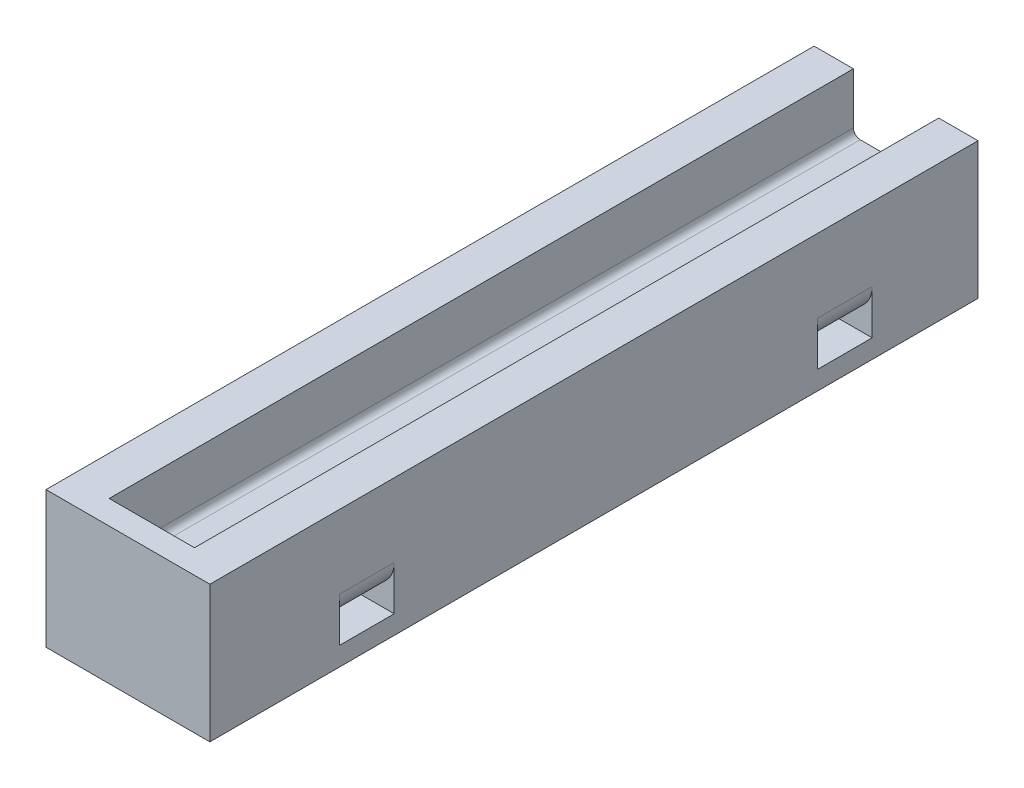
ISO-10303-21;
HEADER;
FILE_DESCRIPTION(('STEP AP214'),'2;1');
FILE_NAME('part.step','',(''),(''),'','','');
FILE_SCHEMA(('AUTOMOTIVE_DESIGN { 1 0 10303 214 1 1 1 1 }'));
ENDSEC;
DATA;
#1=APPLICATION_CONTEXT('core data for automotive mechanical design processes');
#2=APPLICATION_PROTOCOL_DEFINITION('international standard','automotive_design',2000,#1);
#3=PRODUCT_CONTEXT('',#1,'mechanical');
#4=PRODUCT('Part','Part','',(#3));
#5=PRODUCT_RELATED_PRODUCT_CATEGORY('part','',(#4));
#6=PRODUCT_DEFINITION_FORMATION('','',#4);
#7=PRODUCT_DEFINITION_CONTEXT('part definition',#1,'design');
#8=PRODUCT_DEFINITION('design','',#6,#7);
#9=PRODUCT_DEFINITION_SHAPE('','',#8);
#10=(LENGTH_UNIT() NAMED_UNIT(*) SI_UNIT(.MILLI.,.METRE.));
#11=(NAMED_UNIT(*) PLANE_ANGLE_UNIT() SI_UNIT($,.RADIAN.));
#12=(NAMED_UNIT(*) SI_UNIT($,.STERADIAN.) SOLID_ANGLE_UNIT());
#13=UNCERTAINTY_MEASURE_WITH_UNIT(LENGTH_MEASURE(1.E-05),#10,'distance_accuracy_value','');
#14=(GEOMETRIC_REPRESENTATION_CONTEXT(3) GLOBAL_UNCERTAINTY_ASSIGNED_CONTEXT((#13)) GLOBAL_UNIT_ASSIGNED_CONTEXT((#10,
#11,#12)) REPRESENTATION_CONTEXT('',''));
#15=CARTESIAN_POINT('',(0.,0.,0.));
#16=DIRECTION('',(0.,0.,1.));
#17=DIRECTION('',(1.,0.,0.));
#18=AXIS2_PLACEMENT_3D('',#15,#16,#17);
#19=CARTESIAN_POINT('',(-43.,0.,109.));
#20=DIRECTION('',(-1.,0.,0.));
#21=DIRECTION('',(0.,0.,1.));
#22=AXIS2_PLACEMENT_3D('',#19,#20,#21);
#23=PLANE('',#22);
#24=DIRECTION('',(0.,0.,1.));
#25=VECTOR('',#24,1.);
#26=CARTESIAN_POINT('',(-43.,9.25,93.5));
#27=LINE('',#26,#25);
#28=CARTESIAN_POINT('',(-43.,9.25,85.5));
#29=VERTEX_POINT('',#28);
#30=CARTESIAN_POINT('',(-43.,9.25,93.5));
#31=VERTEX_POINT('',#30);
#32=EDGE_CURVE('E219',#29,#31,#27,.T.);
#33=ORIENTED_EDGE('',*,*,#32,.T.);
#34=DIRECTION('',(0.,-1.,0.));
#35=VECTOR('',#34,1.);
#36=CARTESIAN_POINT('',(-43.,2.75,93.5));
#37=LINE('',#36,#35);
#38=CARTESIAN_POINT('',(-43.,2.75,93.5));
#39=VERTEX_POINT('',#38);
#40=EDGE_CURVE('E199',#31,#39,#37,.T.);
#41=ORIENTED_EDGE('',*,*,#40,.T.);
#42=DIRECTION('',(0.,0.,-1.));
#43=VECTOR('',#42,1.);
#44=CARTESIAN_POINT('',(-43.,2.75,93.5));
#45=LINE('',#44,#43);
#46=CARTESIAN_POINT('',(-43.,2.75,85.5));
#47=VERTEX_POINT('',#46);
#48=EDGE_CURVE('E210',#39,#47,#45,.T.);
#49=ORIENTED_EDGE('',*,*,#48,.T.);
#50=DIRECTION('',(0.,1.,0.));
#51=VECTOR('',#50,1.);
#52=CARTESIAN_POINT('',(-43.,2.75,85.5));
#53=LINE('',#52,#51);
#54=EDGE_CURVE('E220',#47,#29,#53,.T.);
#55=ORIENTED_EDGE('',*,*,#54,.T.);
#56=EDGE_LOOP('',(#33,#41,#49,#55));
#57=FACE_BOUND('',#56,.T.);
#58=DIRECTION('',(0.,0.,1.));
#59=VECTOR('',#58,1.);
#60=CARTESIAN_POINT('',(-43.,9.25,23.5));
#61=LINE('',#60,#59);
#62=CARTESIAN_POINT('',(-43.,9.25,15.5));
#63=VERTEX_POINT('',#62);
#64=CARTESIAN_POINT('',(-43.,9.25,23.5));
#65=VERTEX_POINT('',#64);
#66=EDGE_CURVE('E325',#63,#65,#61,.T.);
#67=ORIENTED_EDGE('',*,*,#66,.T.);
#68=DIRECTION('',(0.,-1.,0.));
#69=VECTOR('',#68,1.);
#70=CARTESIAN_POINT('',(-43.,2.75,23.5));
#71=LINE('',#70,#69);
#72=CARTESIAN_POINT('',(-43.,2.75,23.5));
#73=VERTEX_POINT('',#72);
#74=EDGE_CURVE('E251',#65,#73,#71,.T.);
#75=ORIENTED_EDGE('',*,*,#74,.T.);
#76=DIRECTION('',(0.,0.,-1.));
#77=VECTOR('',#76,1.);
#78=CARTESIAN_POINT('',(-43.,2.75,15.5));
#79=LINE('',#78,#77);
#80=CARTESIAN_POINT('',(-43.,2.75,15.5));
#81=VERTEX_POINT('',#80);
#82=EDGE_CURVE('E256',#73,#81,#79,.T.);
#83=ORIENTED_EDGE('',*,*,#82,.T.);
#84=DIRECTION('',(0.,1.,0.));
#85=VECTOR('',#84,1.);
#86=CARTESIAN_POINT('',(-43.,2.75,15.5));
#87=LINE('',#86,#85);
#88=EDGE_CURVE('E239',#81,#63,#87,.T.);
#89=ORIENTED_EDGE('',*,*,#88,.T.);
#90=EDGE_LOOP('',(#67,#75,#83,#89));
#91=FACE_BOUND('',#90,.T.);
#92=DIRECTION('',(0.,1.,0.));
#93=VECTOR('',#92,1.);
#94=CARTESIAN_POINT('',(-43.,0.,0.));
#95=LINE('',#94,#93);
#96=CARTESIAN_POINT('',(-43.,0.,0.));
#97=VERTEX_POINT('',#96);
#98=CARTESIAN_POINT('',(-43.,20.,0.));
#99=VERTEX_POINT('',#98);
#100=EDGE_CURVE('E279',#97,#99,#95,.T.);
#101=ORIENTED_EDGE('',*,*,#100,.F.);
#102=DIRECTION('',(0.,0.,-1.));
#103=VECTOR('',#102,1.);
#104=CARTESIAN_POINT('',(-43.,0.,109.));
#105=LINE('',#104,#103);
#106=CARTESIAN_POINT('',(-43.,0.,112.5));
#107=VERTEX_POINT('',#106);
#108=EDGE_CURVE('E322',#107,#97,#105,.T.);
#109=ORIENTED_EDGE('',*,*,#108,.F.);
#110=DIRECTION('',(0.,-1.,0.));
#111=VECTOR('',#110,1.);
#112=CARTESIAN_POINT('',(-43.,20.,112.5));
#113=LINE('',#112,#111);
#114=CARTESIAN_POINT('',(-43.,20.,112.5));
#115=VERTEX_POINT('',#114);
#116=EDGE_CURVE('E267',#115,#107,#113,.T.);
#117=ORIENTED_EDGE('',*,*,#116,.F.);
#118=DIRECTION('',(0.,0.,-1.));
#119=VECTOR('',#118,1.);
#120=CARTESIAN_POINT('',(-43.,20.,109.));
#121=LINE('',#120,#119);
#122=EDGE_CURVE('E291',#115,#99,#121,.T.);
#123=ORIENTED_EDGE('',*,*,#122,.T.);
#124=EDGE_LOOP('',(#101,#109,#117,#123));
#125=FACE_BOUND('',#124,.T.);
#126=ADVANCED_FACE('F43',(#57,#91,#125),#23,.T.);
#127=CARTESIAN_POINT('',(0.,0.,109.));
#128=DIRECTION('',(0.,-1.,0.));
#129=DIRECTION('',(1.,0.,0.));
#130=AXIS2_PLACEMENT_3D('',#127,#128,#129);
#131=PLANE('',#130);
#132=DIRECTION('',(-1.,0.,0.));
#133=VECTOR('',#132,1.);
#134=CARTESIAN_POINT('',(0.,0.,0.));
#135=LINE('',#134,#133);
#136=CARTESIAN_POINT('',(-19.,0.,0.));
#137=VERTEX_POINT('',#136);
#138=EDGE_CURVE('E294',#137,#97,#135,.T.);
#139=ORIENTED_EDGE('',*,*,#138,.F.);
#140=DIRECTION('',(0.,0.,-1.));
#141=VECTOR('',#140,1.);
#142=CARTESIAN_POINT('',(-19.,0.,109.));
#143=LINE('',#142,#141);
#144=CARTESIAN_POINT('',(-19.,0.,112.5));
#145=VERTEX_POINT('',#144);
#146=EDGE_CURVE('E320',#145,#137,#143,.T.);
#147=ORIENTED_EDGE('',*,*,#146,.F.);
#148=DIRECTION('',(1.,0.,0.));
#149=VECTOR('',#148,1.);
#150=CARTESIAN_POINT('',(-43.,0.,112.5));
#151=LINE('',#150,#149);
#152=EDGE_CURVE('E270',#107,#145,#151,.T.);
#153=ORIENTED_EDGE('',*,*,#152,.F.);
#154=ORIENTED_EDGE('',*,*,#108,.T.);
#155=EDGE_LOOP('',(#139,#147,#153,#154));
#156=FACE_BOUND('',#155,.T.);
#157=ADVANCED_FACE('F431',(#156),#131,.T.);
#158=CARTESIAN_POINT('',(-19.,0.,109.));
#159=DIRECTION('',(-1.,0.,0.));
#160=DIRECTION('',(0.,0.,1.));
#161=AXIS2_PLACEMENT_3D('',#158,#159,#160);
#162=PLANE('',#161);
#163=DIRECTION('',(0.,-1.,0.));
#164=VECTOR('',#163,1.);
#165=CARTESIAN_POINT('',(-19.,2.75,93.5));
#166=LINE('',#165,#164);
#167=CARTESIAN_POINT('',(-19.,9.25,93.5));
#168=VERTEX_POINT('',#167);
#169=CARTESIAN_POINT('',(-19.,2.75,93.5));
#170=VERTEX_POINT('',#169);
#171=EDGE_CURVE('E202',#168,#170,#166,.T.);
#172=ORIENTED_EDGE('',*,*,#171,.F.);
#173=DIRECTION('',(0.,0.,1.));
#174=VECTOR('',#173,1.);
#175=CARTESIAN_POINT('',(-19.,9.25,109.));
#176=LINE('',#175,#174);
#177=CARTESIAN_POINT('',(-19.,9.25,85.5));
#178=VERTEX_POINT('',#177);
#179=EDGE_CURVE('E338',#168,#178,#176,.F.);
#180=ORIENTED_EDGE('',*,*,#179,.T.);
#181=DIRECTION('',(0.,1.,0.));
#182=VECTOR('',#181,1.);
#183=CARTESIAN_POINT('',(-19.,2.75,85.5));
#184=LINE('',#183,#182);
#185=CARTESIAN_POINT('',(-19.,2.75,85.5));
#186=VERTEX_POINT('',#185);
#187=EDGE_CURVE('E225',#186,#178,#184,.T.);
#188=ORIENTED_EDGE('',*,*,#187,.F.);
#189=DIRECTION('',(0.,0.,-1.));
#190=VECTOR('',#189,1.);
#191=CARTESIAN_POINT('',(-19.,2.75,93.5));
#192=LINE('',#191,#190);
#193=EDGE_CURVE('E222',#170,#186,#192,.T.);
#194=ORIENTED_EDGE('',*,*,#193,.F.);
#195=EDGE_LOOP('',(#172,#180,#188,#194));
#196=FACE_BOUND('',#195,.T.);
#197=DIRECTION('',(0.,-1.,0.));
#198=VECTOR('',#197,1.);
#199=CARTESIAN_POINT('',(-19.,2.75,23.5));
#200=LINE('',#199,#198);
#201=CARTESIAN_POINT('',(-19.,9.25,23.5));
#202=VERTEX_POINT('',#201);
#203=CARTESIAN_POINT('',(-19.,2.75,23.5));
#204=VERTEX_POINT('',#203);
#205=EDGE_CURVE('E227',#202,#204,#200,.T.);
#206=ORIENTED_EDGE('',*,*,#205,.F.);
#207=DIRECTION('',(0.,0.,1.));
#208=VECTOR('',#207,1.);
#209=CARTESIAN_POINT('',(-19.,9.24999999999999,109.));
#210=LINE('',#209,#208);
#211=CARTESIAN_POINT('',(-19.,9.25,15.5));
#212=VERTEX_POINT('',#211);
#213=EDGE_CURVE('E341',#202,#212,#210,.F.);
#214=ORIENTED_EDGE('',*,*,#213,.T.);
#215=DIRECTION('',(0.,1.,0.));
#216=VECTOR('',#215,1.);
#217=CARTESIAN_POINT('',(-19.,2.75,15.5));
#218=LINE('',#217,#216);
#219=CARTESIAN_POINT('',(-19.,2.75,15.5));
#220=VERTEX_POINT('',#219);
#221=EDGE_CURVE('E248',#220,#212,#218,.T.);
#222=ORIENTED_EDGE('',*,*,#221,.F.);
#223=DIRECTION('',(0.,0.,-1.));
#224=VECTOR('',#223,1.);
#225=CARTESIAN_POINT('',(-19.,2.75,15.5));
#226=LINE('',#225,#224);
#227=EDGE_CURVE('E250',#204,#220,#226,.T.);
#228=ORIENTED_EDGE('',*,*,#227,.F.);
#229=EDGE_LOOP('',(#206,#214,#222,#228));
#230=FACE_BOUND('',#229,.T.);
#231=DIRECTION('',(0.,1.,0.));
#232=VECTOR('',#231,1.);
#233=CARTESIAN_POINT('',(-19.,0.,0.));
#234=LINE('',#233,#232);
#235=CARTESIAN_POINT('',(-19.,20.,0.));
#236=VERTEX_POINT('',#235);
#237=EDGE_CURVE('E297',#137,#236,#234,.T.);
#238=ORIENTED_EDGE('',*,*,#237,.T.);
#239=DIRECTION('',(0.,0.,-1.));
#240=VECTOR('',#239,1.);
#241=CARTESIAN_POINT('',(-19.,20.,109.));
#242=LINE('',#241,#240);
#243=CARTESIAN_POINT('',(-19.,20.,112.5));
#244=VERTEX_POINT('',#243);
#245=EDGE_CURVE('E318',#244,#236,#242,.T.);
#246=ORIENTED_EDGE('',*,*,#245,.F.);
#247=DIRECTION('',(0.,1.,0.));
#248=VECTOR('',#247,1.);
#249=CARTESIAN_POINT('',(-19.,20.,112.5));
#250=LINE('',#249,#248);
#251=EDGE_CURVE('E273',#145,#244,#250,.T.);
#252=ORIENTED_EDGE('',*,*,#251,.F.);
#253=ORIENTED_EDGE('',*,*,#146,.T.);
#254=EDGE_LOOP('',(#238,#246,#252,#253));
#255=FACE_BOUND('',#254,.T.);
#256=ADVANCED_FACE('F420',(#196,#230,#255),#162,.F.);
#257=CARTESIAN_POINT('',(-24.75,0.,109.));
#258=DIRECTION('',(-1.,0.,0.));
#259=DIRECTION('',(0.,0.,1.));
#260=AXIS2_PLACEMENT_3D('',#257,#258,#259);
#261=PLANE('',#260);
#262=DIRECTION('',(0.,1.,0.));
#263=VECTOR('',#262,1.);
#264=CARTESIAN_POINT('',(-24.75,0.,0.));
#265=LINE('',#264,#263);
#266=CARTESIAN_POINT('',(-24.75,12.5,0.));
#267=VERTEX_POINT('',#266);
#268=CARTESIAN_POINT('',(-24.75,20.,0.));
#269=VERTEX_POINT('',#268);
#270=EDGE_CURVE('E303',#267,#269,#265,.T.);
#271=ORIENTED_EDGE('',*,*,#270,.F.);
#272=DIRECTION('',(0.,0.,-1.));
#273=VECTOR('',#272,1.);
#274=CARTESIAN_POINT('',(-24.75,12.5,109.));
#275=LINE('',#274,#273);
#276=CARTESIAN_POINT('',(-24.75,12.5,109.));
#277=VERTEX_POINT('',#276);
#278=EDGE_CURVE('E63',#267,#277,#275,.F.);
#279=ORIENTED_EDGE('',*,*,#278,.T.);
#280=DIRECTION('',(0.,1.,0.));
#281=VECTOR('',#280,1.);
#282=CARTESIAN_POINT('',(-24.75,0.,109.));
#283=LINE('',#282,#281);
#284=CARTESIAN_POINT('',(-24.75,20.,109.));
#285=VERTEX_POINT('',#284);
#286=EDGE_CURVE('E282',#277,#285,#283,.T.);
#287=ORIENTED_EDGE('',*,*,#286,.T.);
#288=DIRECTION('',(0.,0.,-1.));
#289=VECTOR('',#288,1.);
#290=CARTESIAN_POINT('',(-24.75,20.,109.));
#291=LINE('',#290,#289);
#292=EDGE_CURVE('E315',#285,#269,#291,.T.);
#293=ORIENTED_EDGE('',*,*,#292,.T.);
#294=EDGE_LOOP('',(#271,#279,#287,#293));
#295=FACE_BOUND('',#294,.T.);
#296=ADVANCED_FACE('F422',(#295),#261,.T.);
#297=CARTESIAN_POINT('',(0.,11.5,109.));
#298=DIRECTION('',(0.,1.,0.));
#299=DIRECTION('',(0.,0.,1.));
#300=AXIS2_PLACEMENT_3D('',#297,#298,#299);
#301=PLANE('',#300);
#302=DIRECTION('',(1.,0.,0.));
#303=VECTOR('',#302,1.);
#304=CARTESIAN_POINT('',(0.,11.5,0.));
#305=LINE('',#304,#303);
#306=CARTESIAN_POINT('',(-36.25,11.5,0.));
#307=VERTEX_POINT('',#306);
#308=CARTESIAN_POINT('',(-25.75,11.5,0.));
#309=VERTEX_POINT('',#308);
#310=EDGE_CURVE('E305',#307,#309,#305,.T.);
#311=ORIENTED_EDGE('',*,*,#310,.F.);
#312=DIRECTION('',(0.,0.,-1.));
#313=VECTOR('',#312,1.);
#314=CARTESIAN_POINT('',(-36.25,11.5,109.));
#315=LINE('',#314,#313);
#316=CARTESIAN_POINT('',(-36.25,11.5,109.));
#317=VERTEX_POINT('',#316);
#318=EDGE_CURVE('E381',#307,#317,#315,.F.);
#319=ORIENTED_EDGE('',*,*,#318,.T.);
#320=DIRECTION('',(1.,0.,0.));
#321=VECTOR('',#320,1.);
#322=CARTESIAN_POINT('',(0.,11.5,109.));
#323=LINE('',#322,#321);
#324=CARTESIAN_POINT('',(-25.75,11.5,109.));
#325=VERTEX_POINT('',#324);
#326=EDGE_CURVE('E284',#317,#325,#323,.T.);
#327=ORIENTED_EDGE('',*,*,#326,.T.);
#328=DIRECTION('',(0.,0.,-1.));
#329=VECTOR('',#328,1.);
#330=CARTESIAN_POINT('',(-25.75,11.5,0.));
#331=LINE('',#330,#329);
#332=EDGE_CURVE('E378',#325,#309,#331,.T.);
#333=ORIENTED_EDGE('',*,*,#332,.T.);
#334=EDGE_LOOP('',(#311,#319,#327,#333));
#335=FACE_BOUND('',#334,.T.);
#336=ADVANCED_FACE('F395',(#335),#301,.T.);
#337=CARTESIAN_POINT('',(-37.25,0.,109.));
#338=DIRECTION('',(1.,0.,0.));
#339=DIRECTION('',(0.,0.,-1.));
#340=AXIS2_PLACEMENT_3D('',#337,#338,#339);
#341=PLANE('',#340);
#342=DIRECTION('',(0.,-1.,0.));
#343=VECTOR('',#342,1.);
#344=CARTESIAN_POINT('',(-37.25,0.,109.));
#345=LINE('',#344,#343);
#346=CARTESIAN_POINT('',(-37.25,20.,109.));
#347=VERTEX_POINT('',#346);
#348=CARTESIAN_POINT('',(-37.25,12.5,109.));
#349=VERTEX_POINT('',#348);
#350=EDGE_CURVE('E288',#347,#349,#345,.T.);
#351=ORIENTED_EDGE('',*,*,#350,.T.);
#352=DIRECTION('',(0.,0.,-1.));
#353=VECTOR('',#352,1.);
#354=CARTESIAN_POINT('',(-37.25,12.5,0.));
#355=LINE('',#354,#353);
#356=CARTESIAN_POINT('',(-37.25,12.5,0.));
#357=VERTEX_POINT('',#356);
#358=EDGE_CURVE('E375',#349,#357,#355,.T.);
#359=ORIENTED_EDGE('',*,*,#358,.T.);
#360=DIRECTION('',(0.,-1.,0.));
#361=VECTOR('',#360,1.);
#362=CARTESIAN_POINT('',(-37.25,0.,0.));
#363=LINE('',#362,#361);
#364=CARTESIAN_POINT('',(-37.25,20.,0.));
#365=VERTEX_POINT('',#364);
#366=EDGE_CURVE('E307',#365,#357,#363,.T.);
#367=ORIENTED_EDGE('',*,*,#366,.F.);
#368=DIRECTION('',(0.,0.,-1.));
#369=VECTOR('',#368,1.);
#370=CARTESIAN_POINT('',(-37.25,20.,109.));
#371=LINE('',#370,#369);
#372=EDGE_CURVE('E313',#347,#365,#371,.T.);
#373=ORIENTED_EDGE('',*,*,#372,.F.);
#374=EDGE_LOOP('',(#351,#359,#367,#373));
#375=FACE_BOUND('',#374,.T.);
#376=ADVANCED_FACE('F405',(#375),#341,.T.);
#377=CARTESIAN_POINT('',(0.,20.,109.));
#378=DIRECTION('',(0.,-1.,0.));
#379=DIRECTION('',(1.,0.,0.));
#380=AXIS2_PLACEMENT_3D('',#377,#378,#379);
#381=PLANE('',#380);
#382=DIRECTION('',(-1.,0.,0.));
#383=VECTOR('',#382,1.);
#384=CARTESIAN_POINT('',(0.,20.,0.));
#385=LINE('',#384,#383);
#386=EDGE_CURVE('E285',#365,#99,#385,.T.);
#387=ORIENTED_EDGE('',*,*,#386,.T.);
#388=ORIENTED_EDGE('',*,*,#122,.F.);
#389=DIRECTION('',(-1.,0.,0.));
#390=VECTOR('',#389,1.);
#391=CARTESIAN_POINT('',(-43.,20.,112.5));
#392=LINE('',#391,#390);
#393=EDGE_CURVE('E276',#244,#115,#392,.T.);
#394=ORIENTED_EDGE('',*,*,#393,.F.);
#395=ORIENTED_EDGE('',*,*,#245,.T.);
#396=DIRECTION('',(1.,0.,0.));
#397=VECTOR('',#396,1.);
#398=CARTESIAN_POINT('',(0.,20.,0.));
#399=LINE('',#398,#397);
#400=EDGE_CURVE('E300',#269,#236,#399,.T.);
#401=ORIENTED_EDGE('',*,*,#400,.F.);
#402=ORIENTED_EDGE('',*,*,#292,.F.);
#403=DIRECTION('',(-1.,0.,0.));
#404=VECTOR('',#403,1.);
#405=CARTESIAN_POINT('',(-43.,20.,109.));
#406=LINE('',#405,#404);
#407=EDGE_CURVE('E266',#285,#347,#406,.T.);
#408=ORIENTED_EDGE('',*,*,#407,.T.);
#409=ORIENTED_EDGE('',*,*,#372,.T.);
#410=EDGE_LOOP('',(#387,#388,#394,#395,#401,#402,#408,#409));
#411=FACE_BOUND('',#410,.T.);
#412=ADVANCED_FACE('F407',(#411),#381,.F.);
#413=CARTESIAN_POINT('',(0.,0.,0.));
#414=DIRECTION('',(0.,0.,1.));
#415=DIRECTION('',(1.,0.,0.));
#416=AXIS2_PLACEMENT_3D('',#413,#414,#415);
#417=PLANE('',#416);
#418=CARTESIAN_POINT('',(-36.,5.6,0.));
#419=DIRECTION('',(0.,0.,1.));
#420=DIRECTION('',(1.,0.,0.));
#421=AXIS2_PLACEMENT_3D('',#418,#419,#420);
#422=CIRCLE('',#421,2.09999999999998);
#423=CARTESIAN_POINT('',(-33.9,5.6,0.));
#424=VERTEX_POINT('',#423);
#425=EDGE_CURVE('E369',#424,#424,#422,.T.);
#426=ORIENTED_EDGE('',*,*,#425,.T.);
#427=EDGE_LOOP('',(#426));
#428=FACE_BOUND('',#427,.T.);
#429=CARTESIAN_POINT('',(-26.,5.6,0.));
#430=DIRECTION('',(0.,0.,1.));
#431=DIRECTION('',(1.,0.,0.));
#432=AXIS2_PLACEMENT_3D('',#429,#430,#431);
#433=CIRCLE('',#432,2.09999999999998);
#434=CARTESIAN_POINT('',(-23.9,5.6,0.));
#435=VERTEX_POINT('',#434);
#436=EDGE_CURVE('E366',#435,#435,#433,.T.);
#437=ORIENTED_EDGE('',*,*,#436,.T.);
#438=EDGE_LOOP('',(#437));
#439=FACE_BOUND('',#438,.T.);
#440=ORIENTED_EDGE('',*,*,#100,.T.);
#441=ORIENTED_EDGE('',*,*,#386,.F.);
#442=ORIENTED_EDGE('',*,*,#366,.T.);
#443=CARTESIAN_POINT('',(-36.25,12.5,0.));
#444=DIRECTION('',(0.,0.,1.));
#445=DIRECTION('',(1.,0.,0.));
#446=AXIS2_PLACEMENT_3D('',#443,#444,#445);
#447=CIRCLE('',#446,1.);
#448=EDGE_CURVE('E51',#357,#307,#447,.T.);
#449=ORIENTED_EDGE('',*,*,#448,.T.);
#450=ORIENTED_EDGE('',*,*,#310,.T.);
#451=CARTESIAN_POINT('',(-25.75,12.5,0.));
#452=DIRECTION('',(0.,0.,1.));
#453=DIRECTION('',(1.,0.,0.));
#454=AXIS2_PLACEMENT_3D('',#451,#452,#453);
#455=CIRCLE('',#454,1.);
#456=EDGE_CURVE('E11',#309,#267,#455,.T.);
#457=ORIENTED_EDGE('',*,*,#456,.T.);
#458=ORIENTED_EDGE('',*,*,#270,.T.);
#459=ORIENTED_EDGE('',*,*,#400,.T.);
#460=ORIENTED_EDGE('',*,*,#237,.F.);
#461=ORIENTED_EDGE('',*,*,#138,.T.);
#462=EDGE_LOOP('',(#440,#441,#442,#449,#450,#457,#458,#459,#460,#461));
#463=FACE_BOUND('',#462,.T.);
#464=ADVANCED_FACE('F388',(#428,#439,#463),#417,.F.);
#465=CARTESIAN_POINT('',(0.,0.,112.5));
#466=DIRECTION('',(0.,0.,1.));
#467=DIRECTION('',(1.,0.,0.));
#468=AXIS2_PLACEMENT_3D('',#465,#466,#467);
#469=PLANE('',#468);
#470=ORIENTED_EDGE('',*,*,#116,.T.);
#471=ORIENTED_EDGE('',*,*,#152,.T.);
#472=ORIENTED_EDGE('',*,*,#251,.T.);
#473=ORIENTED_EDGE('',*,*,#393,.T.);
#474=EDGE_LOOP('',(#470,#471,#472,#473));
#475=FACE_BOUND('',#474,.T.);
#476=ADVANCED_FACE('F417',(#475),#469,.T.);
#477=CARTESIAN_POINT('',(0.,0.,109.));
#478=DIRECTION('',(0.,0.,1.));
#479=DIRECTION('',(1.,0.,0.));
#480=AXIS2_PLACEMENT_3D('',#477,#478,#479);
#481=PLANE('',#480);
#482=ORIENTED_EDGE('',*,*,#326,.F.);
#483=CARTESIAN_POINT('',(-36.25,12.5,109.));
#484=DIRECTION('',(0.,0.,1.));
#485=DIRECTION('',(1.,0.,0.));
#486=AXIS2_PLACEMENT_3D('',#483,#484,#485);
#487=CIRCLE('',#486,1.);
#488=EDGE_CURVE('E385',#317,#349,#487,.F.);
#489=ORIENTED_EDGE('',*,*,#488,.T.);
#490=ORIENTED_EDGE('',*,*,#350,.F.);
#491=ORIENTED_EDGE('',*,*,#407,.F.);
#492=ORIENTED_EDGE('',*,*,#286,.F.);
#493=CARTESIAN_POINT('',(-25.75,12.5,109.));
#494=DIRECTION('',(0.,0.,1.));
#495=DIRECTION('',(1.,0.,0.));
#496=AXIS2_PLACEMENT_3D('',#493,#494,#495);
#497=CIRCLE('',#496,1.);
#498=EDGE_CURVE('E383',#277,#325,#497,.F.);
#499=ORIENTED_EDGE('',*,*,#498,.T.);
#500=EDGE_LOOP('',(#482,#489,#490,#491,#492,#499));
#501=FACE_BOUND('',#500,.T.);
#502=ADVANCED_FACE('F401',(#501),#481,.F.);
#503=CARTESIAN_POINT('',(-36.,5.6,6.50000000000001));
#504=DIRECTION('',(0.,0.,-1.));
#505=DIRECTION('',(-1.,0.,0.));
#506=AXIS2_PLACEMENT_3D('',#503,#504,#505);
#507=CONICAL_SURFACE('',#506,1.59999999999999,1.02974425867666);
#508=CARTESIAN_POINT('',(-36.,5.6,7.46137699044409));
#509=VERTEX_POINT('',#508);
#510=VERTEX_LOOP('',#509);
#511=FACE_BOUND('',#510,.T.);
#512=CARTESIAN_POINT('',(-36.,5.6,6.50000000000001));
#513=DIRECTION('',(0.,0.,-1.));
#514=DIRECTION('',(-1.,0.,0.));
#515=AXIS2_PLACEMENT_3D('',#512,#513,#514);
#516=CIRCLE('',#515,1.59999999999999);
#517=CARTESIAN_POINT('',(-37.6,5.6,6.50000000000001));
#518=VERTEX_POINT('',#517);
#519=EDGE_CURVE('E263',#518,#518,#516,.T.);
#520=ORIENTED_EDGE('',*,*,#519,.T.);
#521=EDGE_LOOP('',(#520));
#522=FACE_BOUND('',#521,.T.);
#523=ADVANCED_FACE('F495',(#511,#522),#507,.F.);
#524=CARTESIAN_POINT('',(-36.,5.6,0.));
#525=DIRECTION('',(0.,0.,-1.));
#526=DIRECTION('',(-1.,0.,0.));
#527=AXIS2_PLACEMENT_3D('',#524,#525,#526);
#528=CYLINDRICAL_SURFACE('',#527,1.59999999999999);
#529=CARTESIAN_POINT('',(-36.,5.6,0.499999999999992));
#530=DIRECTION('',(0.,0.,1.));
#531=DIRECTION('',(1.,0.,0.));
#532=AXIS2_PLACEMENT_3D('',#529,#530,#531);
#533=CIRCLE('',#532,1.59999999999999);
#534=CARTESIAN_POINT('',(-34.4,5.6,0.499999999999992));
#535=VERTEX_POINT('',#534);
#536=EDGE_CURVE('E363',#535,#535,#533,.F.);
#537=ORIENTED_EDGE('',*,*,#536,.T.);
#538=EDGE_LOOP('',(#537));
#539=FACE_BOUND('',#538,.T.);
#540=ORIENTED_EDGE('',*,*,#519,.F.);
#541=EDGE_LOOP('',(#540));
#542=FACE_BOUND('',#541,.T.);
#543=ADVANCED_FACE('F487',(#539,#542),#528,.F.);
#544=CARTESIAN_POINT('',(-26.,5.6,6.50000000000001));
#545=DIRECTION('',(0.,0.,-1.));
#546=DIRECTION('',(-1.,0.,0.));
#547=AXIS2_PLACEMENT_3D('',#544,#545,#546);
#548=CONICAL_SURFACE('',#547,1.59999999999999,1.02974425867665);
#549=CARTESIAN_POINT('',(-26.,5.6,7.46137699044409));
#550=VERTEX_POINT('',#549);
#551=VERTEX_LOOP('',#550);
#552=FACE_BOUND('',#551,.T.);
#553=CARTESIAN_POINT('',(-26.,5.6,6.50000000000001));
#554=DIRECTION('',(0.,0.,-1.));
#555=DIRECTION('',(-1.,0.,0.));
#556=AXIS2_PLACEMENT_3D('',#553,#554,#555);
#557=CIRCLE('',#556,1.59999999999999);
#558=CARTESIAN_POINT('',(-27.6,5.6,6.50000000000001));
#559=VERTEX_POINT('',#558);
#560=EDGE_CURVE('E230',#559,#559,#557,.T.);
#561=ORIENTED_EDGE('',*,*,#560,.T.);
#562=EDGE_LOOP('',(#561));
#563=FACE_BOUND('',#562,.T.);
#564=ADVANCED_FACE('F482',(#552,#563),#548,.F.);
#565=CARTESIAN_POINT('',(-26.,5.6,0.));
#566=DIRECTION('',(0.,0.,-1.));
#567=DIRECTION('',(-1.,0.,0.));
#568=AXIS2_PLACEMENT_3D('',#565,#566,#567);
#569=CYLINDRICAL_SURFACE('',#568,1.59999999999999);
#570=CARTESIAN_POINT('',(-26.,5.6,0.499999999999994));
#571=DIRECTION('',(0.,0.,1.));
#572=DIRECTION('',(1.,0.,0.));
#573=AXIS2_PLACEMENT_3D('',#570,#571,#572);
#574=CIRCLE('',#573,1.59999999999999);
#575=CARTESIAN_POINT('',(-24.4,5.6,0.499999999999994));
#576=VERTEX_POINT('',#575);
#577=EDGE_CURVE('E372',#576,#576,#574,.F.);
#578=ORIENTED_EDGE('',*,*,#577,.T.);
#579=EDGE_LOOP('',(#578));
#580=FACE_BOUND('',#579,.T.);
#581=ORIENTED_EDGE('',*,*,#560,.F.);
#582=EDGE_LOOP('',(#581));
#583=FACE_BOUND('',#582,.T.);
#584=ADVANCED_FACE('F478',(#580,#583),#569,.F.);
#585=CARTESIAN_POINT('',(-43.,2.75,23.5));
#586=DIRECTION('',(0.,0.,1.));
#587=DIRECTION('',(0.,-1.,0.));
#588=AXIS2_PLACEMENT_3D('',#585,#586,#587);
#589=PLANE('',#588);
#590=ORIENTED_EDGE('',*,*,#205,.T.);
#591=DIRECTION('',(1.,0.,0.));
#592=VECTOR('',#591,1.);
#593=CARTESIAN_POINT('',(-43.,2.75,23.5));
#594=LINE('',#593,#592);
#595=EDGE_CURVE('E236',#73,#204,#594,.T.);
#596=ORIENTED_EDGE('',*,*,#595,.F.);
#597=ORIENTED_EDGE('',*,*,#74,.F.);
#598=CARTESIAN_POINT('',(-39.,9.25,23.5));
#599=DIRECTION('',(0.,0.,1.));
#600=DIRECTION('',(0.,-1.,0.));
#601=AXIS2_PLACEMENT_3D('',#598,#599,#600);
#602=CIRCLE('',#601,4.);
#603=CARTESIAN_POINT('',(-39.,5.25,23.5));
#604=VERTEX_POINT('',#603);
#605=EDGE_CURVE('E344',#65,#604,#602,.T.);
#606=ORIENTED_EDGE('',*,*,#605,.T.);
#607=DIRECTION('',(1.,0.,0.));
#608=VECTOR('',#607,1.);
#609=CARTESIAN_POINT('',(-43.,5.25,23.5));
#610=LINE('',#609,#608);
#611=CARTESIAN_POINT('',(-23.,5.25,23.5));
#612=VERTEX_POINT('',#611);
#613=EDGE_CURVE('E245',#604,#612,#610,.T.);
#614=ORIENTED_EDGE('',*,*,#613,.T.);
#615=CARTESIAN_POINT('',(-23.,9.25,23.5));
#616=DIRECTION('',(0.,0.,1.));
#617=DIRECTION('',(0.,-1.,0.));
#618=AXIS2_PLACEMENT_3D('',#615,#616,#617);
#619=CIRCLE('',#618,4.);
#620=EDGE_CURVE('E354',#612,#202,#619,.T.);
#621=ORIENTED_EDGE('',*,*,#620,.T.);
#622=EDGE_LOOP('',(#590,#596,#597,#606,#614,#621));
#623=FACE_BOUND('',#622,.T.);
#624=ADVANCED_FACE('F481',(#623),#589,.F.);
#625=CARTESIAN_POINT('',(-43.,5.25,15.5));
#626=DIRECTION('',(0.,1.,0.));
#627=DIRECTION('',(0.,0.,1.));
#628=AXIS2_PLACEMENT_3D('',#625,#626,#627);
#629=PLANE('',#628);
#630=ORIENTED_EDGE('',*,*,#613,.F.);
#631=DIRECTION('',(0.,0.,1.));
#632=VECTOR('',#631,1.);
#633=CARTESIAN_POINT('',(-39.,5.25,15.5));
#634=LINE('',#633,#632);
#635=CARTESIAN_POINT('',(-39.,5.25,15.5));
#636=VERTEX_POINT('',#635);
#637=EDGE_CURVE('E331',#604,#636,#634,.F.);
#638=ORIENTED_EDGE('',*,*,#637,.T.);
#639=DIRECTION('',(1.,0.,0.));
#640=VECTOR('',#639,1.);
#641=CARTESIAN_POINT('',(-43.,5.25,15.5));
#642=LINE('',#641,#640);
#643=CARTESIAN_POINT('',(-23.,5.25,15.5));
#644=VERTEX_POINT('',#643);
#645=EDGE_CURVE('E242',#636,#644,#642,.T.);
#646=ORIENTED_EDGE('',*,*,#645,.T.);
#647=DIRECTION('',(0.,0.,1.));
#648=VECTOR('',#647,1.);
#649=CARTESIAN_POINT('',(-23.,5.25,15.5));
#650=LINE('',#649,#648);
#651=EDGE_CURVE('E328',#644,#612,#650,.T.);
#652=ORIENTED_EDGE('',*,*,#651,.T.);
#653=EDGE_LOOP('',(#630,#638,#646,#652));
#654=FACE_BOUND('',#653,.T.);
#655=ADVANCED_FACE('F532',(#654),#629,.F.);
#656=CARTESIAN_POINT('',(-43.,2.75,15.5));
#657=DIRECTION('',(0.,0.,-1.));
#658=DIRECTION('',(-1.,0.,0.));
#659=AXIS2_PLACEMENT_3D('',#656,#657,#658);
#660=PLANE('',#659);
#661=ORIENTED_EDGE('',*,*,#221,.T.);
#662=CARTESIAN_POINT('',(-23.,9.25,15.5));
#663=DIRECTION('',(0.,0.,-1.));
#664=DIRECTION('',(-1.,0.,0.));
#665=AXIS2_PLACEMENT_3D('',#662,#663,#664);
#666=CIRCLE('',#665,4.);
#667=EDGE_CURVE('E357',#212,#644,#666,.T.);
#668=ORIENTED_EDGE('',*,*,#667,.T.);
#669=ORIENTED_EDGE('',*,*,#645,.F.);
#670=CARTESIAN_POINT('',(-39.,9.25,15.5));
#671=DIRECTION('',(0.,0.,-1.));
#672=DIRECTION('',(-1.,0.,0.));
#673=AXIS2_PLACEMENT_3D('',#670,#671,#672);
#674=CIRCLE('',#673,4.);
#675=EDGE_CURVE('E346',#636,#63,#674,.T.);
#676=ORIENTED_EDGE('',*,*,#675,.T.);
#677=ORIENTED_EDGE('',*,*,#88,.F.);
#678=DIRECTION('',(1.,0.,0.));
#679=VECTOR('',#678,1.);
#680=CARTESIAN_POINT('',(-43.,2.75,15.5));
#681=LINE('',#680,#679);
#682=EDGE_CURVE('E240',#81,#220,#681,.T.);
#683=ORIENTED_EDGE('',*,*,#682,.T.);
#684=EDGE_LOOP('',(#661,#668,#669,#676,#677,#683));
#685=FACE_BOUND('',#684,.T.);
#686=ADVANCED_FACE('F529',(#685),#660,.F.);
#687=CARTESIAN_POINT('',(-43.,2.75,15.5));
#688=DIRECTION('',(0.,-1.,0.));
#689=DIRECTION('',(0.,0.,-1.));
#690=AXIS2_PLACEMENT_3D('',#687,#688,#689);
#691=PLANE('',#690);
#692=ORIENTED_EDGE('',*,*,#227,.T.);
#693=ORIENTED_EDGE('',*,*,#682,.F.);
#694=ORIENTED_EDGE('',*,*,#82,.F.);
#695=ORIENTED_EDGE('',*,*,#595,.T.);
#696=EDGE_LOOP('',(#692,#693,#694,#695));
#697=FACE_BOUND('',#696,.T.);
#698=ADVANCED_FACE('F539',(#697),#691,.F.);
#699=CARTESIAN_POINT('',(-43.,2.75,85.5));
#700=DIRECTION('',(0.,0.,-1.));
#701=DIRECTION('',(-1.,0.,0.));
#702=AXIS2_PLACEMENT_3D('',#699,#700,#701);
#703=PLANE('',#702);
#704=ORIENTED_EDGE('',*,*,#187,.T.);
#705=CARTESIAN_POINT('',(-23.,9.25,85.5));
#706=DIRECTION('',(0.,0.,-1.));
#707=DIRECTION('',(-1.,0.,0.));
#708=AXIS2_PLACEMENT_3D('',#705,#706,#707);
#709=CIRCLE('',#708,4.);
#710=CARTESIAN_POINT('',(-23.,5.25,85.5));
#711=VERTEX_POINT('',#710);
#712=EDGE_CURVE('E361',#178,#711,#709,.T.);
#713=ORIENTED_EDGE('',*,*,#712,.T.);
#714=DIRECTION('',(1.,0.,0.));
#715=VECTOR('',#714,1.);
#716=CARTESIAN_POINT('',(-43.,5.25,85.5));
#717=LINE('',#716,#715);
#718=CARTESIAN_POINT('',(-39.,5.25,85.5));
#719=VERTEX_POINT('',#718);
#720=EDGE_CURVE('E214',#719,#711,#717,.T.);
#721=ORIENTED_EDGE('',*,*,#720,.F.);
#722=CARTESIAN_POINT('',(-39.,9.25,85.5));
#723=DIRECTION('',(0.,0.,-1.));
#724=DIRECTION('',(-1.,0.,0.));
#725=AXIS2_PLACEMENT_3D('',#722,#723,#724);
#726=CIRCLE('',#725,4.);
#727=EDGE_CURVE('E351',#719,#29,#726,.T.);
#728=ORIENTED_EDGE('',*,*,#727,.T.);
#729=ORIENTED_EDGE('',*,*,#54,.F.);
#730=DIRECTION('',(1.,0.,0.));
#731=VECTOR('',#730,1.);
#732=CARTESIAN_POINT('',(-43.,2.75,85.5));
#733=LINE('',#732,#731);
#734=EDGE_CURVE('E206',#47,#186,#733,.T.);
#735=ORIENTED_EDGE('',*,*,#734,.T.);
#736=EDGE_LOOP('',(#704,#713,#721,#728,#729,#735));
#737=FACE_BOUND('',#736,.T.);
#738=ADVANCED_FACE('F540',(#737),#703,.F.);
#739=CARTESIAN_POINT('',(-43.,2.75,93.5));
#740=DIRECTION('',(0.,-1.,0.));
#741=DIRECTION('',(0.,0.,-1.));
#742=AXIS2_PLACEMENT_3D('',#739,#740,#741);
#743=PLANE('',#742);
#744=ORIENTED_EDGE('',*,*,#193,.T.);
#745=ORIENTED_EDGE('',*,*,#734,.F.);
#746=ORIENTED_EDGE('',*,*,#48,.F.);
#747=DIRECTION('',(1.,0.,0.));
#748=VECTOR('',#747,1.);
#749=CARTESIAN_POINT('',(-43.,2.75,93.5));
#750=LINE('',#749,#748);
#751=EDGE_CURVE('E195',#39,#170,#750,.T.);
#752=ORIENTED_EDGE('',*,*,#751,.T.);
#753=EDGE_LOOP('',(#744,#745,#746,#752));
#754=FACE_BOUND('',#753,.T.);
#755=ADVANCED_FACE('F211',(#754),#743,.F.);
#756=CARTESIAN_POINT('',(-43.,2.75,93.5));
#757=DIRECTION('',(0.,0.,1.));
#758=DIRECTION('',(1.,0.,0.));
#759=AXIS2_PLACEMENT_3D('',#756,#757,#758);
#760=PLANE('',#759);
#761=ORIENTED_EDGE('',*,*,#171,.T.);
#762=ORIENTED_EDGE('',*,*,#751,.F.);
#763=ORIENTED_EDGE('',*,*,#40,.F.);
#764=CARTESIAN_POINT('',(-39.,9.25,93.5));
#765=DIRECTION('',(0.,0.,1.));
#766=DIRECTION('',(1.,0.,0.));
#767=AXIS2_PLACEMENT_3D('',#764,#765,#766);
#768=CIRCLE('',#767,4.);
#769=CARTESIAN_POINT('',(-39.,5.25,93.5));
#770=VERTEX_POINT('',#769);
#771=EDGE_CURVE('E349',#31,#770,#768,.T.);
#772=ORIENTED_EDGE('',*,*,#771,.T.);
#773=DIRECTION('',(1.,0.,0.));
#774=VECTOR('',#773,1.);
#775=CARTESIAN_POINT('',(-43.,5.25,93.5));
#776=LINE('',#775,#774);
#777=CARTESIAN_POINT('',(-23.,5.25,93.5));
#778=VERTEX_POINT('',#777);
#779=EDGE_CURVE('E207',#770,#778,#776,.T.);
#780=ORIENTED_EDGE('',*,*,#779,.T.);
#781=CARTESIAN_POINT('',(-23.,9.25,93.5));
#782=DIRECTION('',(0.,0.,1.));
#783=DIRECTION('',(1.,0.,0.));
#784=AXIS2_PLACEMENT_3D('',#781,#782,#783);
#785=CIRCLE('',#784,4.);
#786=EDGE_CURVE('E359',#778,#168,#785,.T.);
#787=ORIENTED_EDGE('',*,*,#786,.T.);
#788=EDGE_LOOP('',(#761,#762,#763,#772,#780,#787));
#789=FACE_BOUND('',#788,.T.);
#790=ADVANCED_FACE('F197',(#789),#760,.F.);
#791=CARTESIAN_POINT('',(-43.,5.25,93.5));
#792=DIRECTION('',(0.,1.,0.));
#793=DIRECTION('',(0.,0.,1.));
#794=AXIS2_PLACEMENT_3D('',#791,#792,#793);
#795=PLANE('',#794);
#796=ORIENTED_EDGE('',*,*,#779,.F.);
#797=DIRECTION('',(0.,0.,1.));
#798=VECTOR('',#797,1.);
#799=CARTESIAN_POINT('',(-39.,5.25,85.5));
#800=LINE('',#799,#798);
#801=EDGE_CURVE('E336',#770,#719,#800,.F.);
#802=ORIENTED_EDGE('',*,*,#801,.T.);
#803=ORIENTED_EDGE('',*,*,#720,.T.);
#804=DIRECTION('',(0.,0.,1.));
#805=VECTOR('',#804,1.);
#806=CARTESIAN_POINT('',(-23.,5.25,93.5));
#807=LINE('',#806,#805);
#808=EDGE_CURVE('E333',#711,#778,#807,.T.);
#809=ORIENTED_EDGE('',*,*,#808,.T.);
#810=EDGE_LOOP('',(#796,#802,#803,#809));
#811=FACE_BOUND('',#810,.T.);
#812=ADVANCED_FACE('F446',(#811),#795,.F.);
#813=CARTESIAN_POINT('',(-39.,9.24999999999999,109.));
#814=DIRECTION('',(0.,0.,-1.));
#815=DIRECTION('',(0.,1.,0.));
#816=AXIS2_PLACEMENT_3D('',#813,#814,#815);
#817=CYLINDRICAL_SURFACE('',#816,4.);
#818=ORIENTED_EDGE('',*,*,#675,.F.);
#819=ORIENTED_EDGE('',*,*,#637,.F.);
#820=ORIENTED_EDGE('',*,*,#605,.F.);
#821=ORIENTED_EDGE('',*,*,#66,.F.);
#822=EDGE_LOOP('',(#818,#819,#820,#821));
#823=FACE_BOUND('',#822,.T.);
#824=ADVANCED_FACE('F442',(#823),#817,.T.);
#825=CARTESIAN_POINT('',(-39.,9.25,109.));
#826=DIRECTION('',(0.,0.,-1.));
#827=DIRECTION('',(-1.,0.,0.));
#828=AXIS2_PLACEMENT_3D('',#825,#826,#827);
#829=CYLINDRICAL_SURFACE('',#828,4.);
#830=ORIENTED_EDGE('',*,*,#727,.F.);
#831=ORIENTED_EDGE('',*,*,#801,.F.);
#832=ORIENTED_EDGE('',*,*,#771,.F.);
#833=ORIENTED_EDGE('',*,*,#32,.F.);
#834=EDGE_LOOP('',(#830,#831,#832,#833));
#835=FACE_BOUND('',#834,.T.);
#836=ADVANCED_FACE('F445',(#835),#829,.T.);
#837=CARTESIAN_POINT('',(-23.,9.25,15.5));
#838=DIRECTION('',(0.,0.,1.));
#839=DIRECTION('',(0.,-1.,0.));
#840=AXIS2_PLACEMENT_3D('',#837,#838,#839);
#841=CYLINDRICAL_SURFACE('',#840,4.);
#842=ORIENTED_EDGE('',*,*,#667,.F.);
#843=ORIENTED_EDGE('',*,*,#213,.F.);
#844=ORIENTED_EDGE('',*,*,#620,.F.);
#845=ORIENTED_EDGE('',*,*,#651,.F.);
#846=EDGE_LOOP('',(#842,#843,#844,#845));
#847=FACE_BOUND('',#846,.T.);
#848=ADVANCED_FACE('F450',(#847),#841,.T.);
#849=CARTESIAN_POINT('',(-23.,9.25,93.5));
#850=DIRECTION('',(0.,0.,1.));
#851=DIRECTION('',(1.,0.,0.));
#852=AXIS2_PLACEMENT_3D('',#849,#850,#851);
#853=CYLINDRICAL_SURFACE('',#852,4.);
#854=ORIENTED_EDGE('',*,*,#712,.F.);
#855=ORIENTED_EDGE('',*,*,#179,.F.);
#856=ORIENTED_EDGE('',*,*,#786,.F.);
#857=ORIENTED_EDGE('',*,*,#808,.F.);
#858=EDGE_LOOP('',(#854,#855,#856,#857));
#859=FACE_BOUND('',#858,.T.);
#860=ADVANCED_FACE('F454',(#859),#853,.T.);
#861=CARTESIAN_POINT('',(-36.,5.6,0.499999999999992));
#862=DIRECTION('',(0.,0.,-1.));
#863=DIRECTION('',(-1.,0.,0.));
#864=AXIS2_PLACEMENT_3D('',#861,#862,#863);
#865=CONICAL_SURFACE('',#864,1.59999999999999,0.785398163397443);
#866=ORIENTED_EDGE('',*,*,#425,.F.);
#867=EDGE_LOOP('',(#866));
#868=FACE_BOUND('',#867,.T.);
#869=ORIENTED_EDGE('',*,*,#536,.F.);
#870=EDGE_LOOP('',(#869));
#871=FACE_BOUND('',#870,.T.);
#872=ADVANCED_FACE('F458',(#868,#871),#865,.F.);
#873=CARTESIAN_POINT('',(-26.,5.6,0.499999999999994));
#874=DIRECTION('',(0.,0.,-1.));
#875=DIRECTION('',(-1.,0.,0.));
#876=AXIS2_PLACEMENT_3D('',#873,#874,#875);
#877=CONICAL_SURFACE('',#876,1.59999999999999,0.785398163397443);
#878=ORIENTED_EDGE('',*,*,#436,.F.);
#879=EDGE_LOOP('',(#878));
#880=FACE_BOUND('',#879,.T.);
#881=ORIENTED_EDGE('',*,*,#577,.F.);
#882=EDGE_LOOP('',(#881));
#883=FACE_BOUND('',#882,.T.);
#884=ADVANCED_FACE('F429',(#880,#883),#877,.F.);
#885=CARTESIAN_POINT('',(-36.25,12.5,109.));
#886=DIRECTION('',(0.,0.,1.));
#887=DIRECTION('',(1.,0.,0.));
#888=AXIS2_PLACEMENT_3D('',#885,#886,#887);
#889=CYLINDRICAL_SURFACE('',#888,1.);
#890=ORIENTED_EDGE('',*,*,#488,.F.);
#891=ORIENTED_EDGE('',*,*,#318,.F.);
#892=ORIENTED_EDGE('',*,*,#448,.F.);
#893=ORIENTED_EDGE('',*,*,#358,.F.);
#894=EDGE_LOOP('',(#890,#891,#892,#893));
#895=FACE_BOUND('',#894,.T.);
#896=ADVANCED_FACE('F399',(#895),#889,.F.);
#897=CARTESIAN_POINT('',(-25.75,12.5,109.));
#898=DIRECTION('',(0.,0.,1.));
#899=DIRECTION('',(1.,0.,0.));
#900=AXIS2_PLACEMENT_3D('',#897,#898,#899);
#901=CYLINDRICAL_SURFACE('',#900,1.);
#902=ORIENTED_EDGE('',*,*,#498,.F.);
#903=ORIENTED_EDGE('',*,*,#278,.F.);
#904=ORIENTED_EDGE('',*,*,#456,.F.);
#905=ORIENTED_EDGE('',*,*,#332,.F.);
#906=EDGE_LOOP('',(#902,#903,#904,#905));
#907=FACE_BOUND('',#906,.T.);
#908=ADVANCED_FACE('F45',(#907),#901,.F.);
#909=CLOSED_SHELL('',(#126,#157,#256,#296,#336,#376,#412,#464,#476,#502,#523,#543,#564,#584,
#624,#655,#686,#698,#738,#755,#790,#812,#824,#836,#848,#860,#872,#884,#896,#908));
#910=MANIFOLD_SOLID_BREP('B2',#909);
#911=ADVANCED_BREP_SHAPE_REPRESENTATION('',(#18,#910),#14);
#912=SHAPE_DEFINITION_REPRESENTATION(#9,#911);
ENDSEC;
END-ISO-10303-21;
